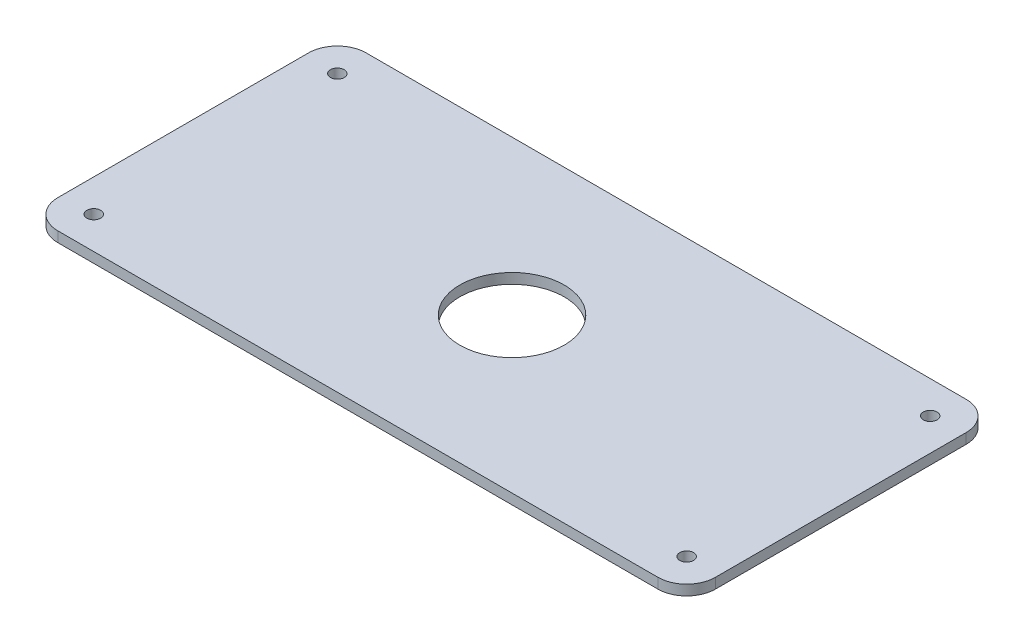
ISO-10303-21;
HEADER;
FILE_DESCRIPTION(('STEP AP214'),'2;1');
FILE_NAME('part.step','',(''),(''),'','','');
FILE_SCHEMA(('AUTOMOTIVE_DESIGN { 1 0 10303 214 1 1 1 1 }'));
ENDSEC;
DATA;
#1=APPLICATION_CONTEXT('core data for automotive mechanical design processes');
#2=APPLICATION_PROTOCOL_DEFINITION('international standard','automotive_design',2000,#1);
#3=PRODUCT_CONTEXT('',#1,'mechanical');
#4=PRODUCT('Part','Part','',(#3));
#5=PRODUCT_RELATED_PRODUCT_CATEGORY('part','',(#4));
#6=PRODUCT_DEFINITION_FORMATION('','',#4);
#7=PRODUCT_DEFINITION_CONTEXT('part definition',#1,'design');
#8=PRODUCT_DEFINITION('design','',#6,#7);
#9=PRODUCT_DEFINITION_SHAPE('','',#8);
#10=(LENGTH_UNIT() NAMED_UNIT(*) SI_UNIT(.MILLI.,.METRE.));
#11=(NAMED_UNIT(*) PLANE_ANGLE_UNIT() SI_UNIT($,.RADIAN.));
#12=(NAMED_UNIT(*) SI_UNIT($,.STERADIAN.) SOLID_ANGLE_UNIT());
#13=UNCERTAINTY_MEASURE_WITH_UNIT(LENGTH_MEASURE(1.E-05),#10,'distance_accuracy_value','');
#14=(GEOMETRIC_REPRESENTATION_CONTEXT(3) GLOBAL_UNCERTAINTY_ASSIGNED_CONTEXT((#13)) GLOBAL_UNIT_ASSIGNED_CONTEXT((#10,
#11,#12)) REPRESENTATION_CONTEXT('',''));
#15=CARTESIAN_POINT('',(0.,0.,0.));
#16=DIRECTION('',(0.,0.,1.));
#17=DIRECTION('',(1.,0.,0.));
#18=AXIS2_PLACEMENT_3D('',#15,#16,#17);
#19=CARTESIAN_POINT('',(203.2,6.35,95.25));
#20=DIRECTION('',(-1.,0.,0.));
#21=DIRECTION('',(0.,0.,1.));
#22=AXIS2_PLACEMENT_3D('',#19,#20,#21);
#23=PLANE('',#22);
#24=DIRECTION('',(0.,0.,-1.));
#25=VECTOR('',#24,1.);
#26=CARTESIAN_POINT('',(203.2,0.,95.25));
#27=LINE('',#26,#25);
#28=CARTESIAN_POINT('',(203.2,0.,77.47));
#29=VERTEX_POINT('',#28);
#30=CARTESIAN_POINT('',(203.2,0.,-77.47));
#31=VERTEX_POINT('',#30);
#32=EDGE_CURVE('E163',#29,#31,#27,.T.);
#33=ORIENTED_EDGE('',*,*,#32,.T.);
#34=DIRECTION('',(0.,-1.,0.));
#35=VECTOR('',#34,1.);
#36=CARTESIAN_POINT('',(203.2,6.35,-77.47));
#37=LINE('',#36,#35);
#38=CARTESIAN_POINT('',(203.2,6.35,-77.47));
#39=VERTEX_POINT('',#38);
#40=EDGE_CURVE('E11',#31,#39,#37,.F.);
#41=ORIENTED_EDGE('',*,*,#40,.T.);
#42=DIRECTION('',(0.,0.,-1.));
#43=VECTOR('',#42,1.);
#44=CARTESIAN_POINT('',(203.2,6.35,95.25));
#45=LINE('',#44,#43);
#46=CARTESIAN_POINT('',(203.2,6.35,77.47));
#47=VERTEX_POINT('',#46);
#48=EDGE_CURVE('E131',#47,#39,#45,.T.);
#49=ORIENTED_EDGE('',*,*,#48,.F.);
#50=DIRECTION('',(0.,-1.,0.));
#51=VECTOR('',#50,1.);
#52=CARTESIAN_POINT('',(203.2,6.35,77.47));
#53=LINE('',#52,#51);
#54=EDGE_CURVE('E47',#47,#29,#53,.T.);
#55=ORIENTED_EDGE('',*,*,#54,.T.);
#56=EDGE_LOOP('',(#33,#41,#49,#55));
#57=FACE_BOUND('',#56,.T.);
#58=ADVANCED_FACE('F39',(#57),#23,.F.);
#59=CARTESIAN_POINT('',(-203.2,6.35,-95.25));
#60=DIRECTION('',(0.,0.,1.));
#61=DIRECTION('',(1.,0.,0.));
#62=AXIS2_PLACEMENT_3D('',#59,#60,#61);
#63=PLANE('',#62);
#64=DIRECTION('',(-1.,0.,0.));
#65=VECTOR('',#64,1.);
#66=CARTESIAN_POINT('',(-203.2,0.,-95.25));
#67=LINE('',#66,#65);
#68=CARTESIAN_POINT('',(185.42,0.,-95.25));
#69=VERTEX_POINT('',#68);
#70=CARTESIAN_POINT('',(-185.42,0.,-95.25));
#71=VERTEX_POINT('',#70);
#72=EDGE_CURVE('E136',#69,#71,#67,.T.);
#73=ORIENTED_EDGE('',*,*,#72,.T.);
#74=DIRECTION('',(0.,-1.,0.));
#75=VECTOR('',#74,1.);
#76=CARTESIAN_POINT('',(-185.42,6.35,-95.25));
#77=LINE('',#76,#75);
#78=CARTESIAN_POINT('',(-185.42,6.35,-95.25));
#79=VERTEX_POINT('',#78);
#80=EDGE_CURVE('E54',#71,#79,#77,.F.);
#81=ORIENTED_EDGE('',*,*,#80,.T.);
#82=DIRECTION('',(-1.,0.,0.));
#83=VECTOR('',#82,1.);
#84=CARTESIAN_POINT('',(-203.2,6.35,-95.25));
#85=LINE('',#84,#83);
#86=CARTESIAN_POINT('',(185.42,6.35,-95.25));
#87=VERTEX_POINT('',#86);
#88=EDGE_CURVE('E134',#87,#79,#85,.T.);
#89=ORIENTED_EDGE('',*,*,#88,.F.);
#90=DIRECTION('',(0.,-1.,0.));
#91=VECTOR('',#90,1.);
#92=CARTESIAN_POINT('',(185.42,6.35,-95.25));
#93=LINE('',#92,#91);
#94=EDGE_CURVE('E155',#87,#69,#93,.T.);
#95=ORIENTED_EDGE('',*,*,#94,.T.);
#96=EDGE_LOOP('',(#73,#81,#89,#95));
#97=FACE_BOUND('',#96,.T.);
#98=ADVANCED_FACE('F223',(#97),#63,.F.);
#99=CARTESIAN_POINT('',(-203.2,6.35,95.25));
#100=DIRECTION('',(1.,0.,0.));
#101=DIRECTION('',(0.,0.,-1.));
#102=AXIS2_PLACEMENT_3D('',#99,#100,#101);
#103=PLANE('',#102);
#104=DIRECTION('',(0.,0.,1.));
#105=VECTOR('',#104,1.);
#106=CARTESIAN_POINT('',(-203.2,0.,95.25));
#107=LINE('',#106,#105);
#108=CARTESIAN_POINT('',(-203.2,0.,-77.47));
#109=VERTEX_POINT('',#108);
#110=CARTESIAN_POINT('',(-203.2,0.,77.47));
#111=VERTEX_POINT('',#110);
#112=EDGE_CURVE('E132',#109,#111,#107,.T.);
#113=ORIENTED_EDGE('',*,*,#112,.T.);
#114=DIRECTION('',(0.,-1.,0.));
#115=VECTOR('',#114,1.);
#116=CARTESIAN_POINT('',(-203.2,6.35,77.47));
#117=LINE('',#116,#115);
#118=CARTESIAN_POINT('',(-203.2,6.35,77.47));
#119=VERTEX_POINT('',#118);
#120=EDGE_CURVE('E110',#111,#119,#117,.F.);
#121=ORIENTED_EDGE('',*,*,#120,.T.);
#122=DIRECTION('',(0.,0.,1.));
#123=VECTOR('',#122,1.);
#124=CARTESIAN_POINT('',(-203.2,6.35,95.25));
#125=LINE('',#124,#123);
#126=CARTESIAN_POINT('',(-203.2,6.35,-77.47));
#127=VERTEX_POINT('',#126);
#128=EDGE_CURVE('E175',#127,#119,#125,.T.);
#129=ORIENTED_EDGE('',*,*,#128,.F.);
#130=DIRECTION('',(0.,-1.,0.));
#131=VECTOR('',#130,1.);
#132=CARTESIAN_POINT('',(-203.2,6.35,-77.47));
#133=LINE('',#132,#131);
#134=EDGE_CURVE('E115',#127,#109,#133,.T.);
#135=ORIENTED_EDGE('',*,*,#134,.T.);
#136=EDGE_LOOP('',(#113,#121,#129,#135));
#137=FACE_BOUND('',#136,.T.);
#138=ADVANCED_FACE('F220',(#137),#103,.F.);
#139=CARTESIAN_POINT('',(-203.2,6.35,95.25));
#140=DIRECTION('',(0.,0.,-1.));
#141=DIRECTION('',(-1.,0.,0.));
#142=AXIS2_PLACEMENT_3D('',#139,#140,#141);
#143=PLANE('',#142);
#144=DIRECTION('',(1.,0.,0.));
#145=VECTOR('',#144,1.);
#146=CARTESIAN_POINT('',(-203.2,6.35,95.25));
#147=LINE('',#146,#145);
#148=CARTESIAN_POINT('',(-185.42,6.35,95.25));
#149=VERTEX_POINT('',#148);
#150=CARTESIAN_POINT('',(185.42,6.35,95.25));
#151=VERTEX_POINT('',#150);
#152=EDGE_CURVE('E125',#149,#151,#147,.T.);
#153=ORIENTED_EDGE('',*,*,#152,.F.);
#154=DIRECTION('',(0.,-1.,0.));
#155=VECTOR('',#154,1.);
#156=CARTESIAN_POINT('',(-185.42,6.35,95.25));
#157=LINE('',#156,#155);
#158=CARTESIAN_POINT('',(-185.42,0.,95.25));
#159=VERTEX_POINT('',#158);
#160=EDGE_CURVE('E109',#149,#159,#157,.T.);
#161=ORIENTED_EDGE('',*,*,#160,.T.);
#162=DIRECTION('',(1.,0.,0.));
#163=VECTOR('',#162,1.);
#164=CARTESIAN_POINT('',(-203.2,0.,95.25));
#165=LINE('',#164,#163);
#166=CARTESIAN_POINT('',(185.42,0.,95.25));
#167=VERTEX_POINT('',#166);
#168=EDGE_CURVE('E122',#159,#167,#165,.T.);
#169=ORIENTED_EDGE('',*,*,#168,.T.);
#170=DIRECTION('',(0.,-1.,0.));
#171=VECTOR('',#170,1.);
#172=CARTESIAN_POINT('',(185.42,6.35,95.25));
#173=LINE('',#172,#171);
#174=EDGE_CURVE('E127',#167,#151,#173,.F.);
#175=ORIENTED_EDGE('',*,*,#174,.T.);
#176=EDGE_LOOP('',(#153,#161,#169,#175));
#177=FACE_BOUND('',#176,.T.);
#178=ADVANCED_FACE('F121',(#177),#143,.F.);
#179=CARTESIAN_POINT('',(0.,6.35,0.));
#180=DIRECTION('',(0.,-1.,0.));
#181=DIRECTION('',(0.,0.,-1.));
#182=AXIS2_PLACEMENT_3D('',#179,#180,#181);
#183=PLANE('',#182);
#184=CARTESIAN_POINT('',(-183.2,6.35,-75.25));
#185=DIRECTION('',(0.,1.,0.));
#186=DIRECTION('',(0.,0.,1.));
#187=AXIS2_PLACEMENT_3D('',#184,#185,#186);
#188=CIRCLE('',#187,4.25000000000001);
#189=CARTESIAN_POINT('',(-183.2,6.35,-71.));
#190=VERTEX_POINT('',#189);
#191=EDGE_CURVE('E185',#190,#190,#188,.T.);
#192=ORIENTED_EDGE('',*,*,#191,.F.);
#193=EDGE_LOOP('',(#192));
#194=FACE_BOUND('',#193,.T.);
#195=CARTESIAN_POINT('',(183.2,6.35,75.25));
#196=DIRECTION('',(0.,1.,0.));
#197=DIRECTION('',(0.,0.,1.));
#198=AXIS2_PLACEMENT_3D('',#195,#196,#197);
#199=CIRCLE('',#198,4.25000000000001);
#200=CARTESIAN_POINT('',(183.2,6.35,79.5));
#201=VERTEX_POINT('',#200);
#202=EDGE_CURVE('E191',#201,#201,#199,.T.);
#203=ORIENTED_EDGE('',*,*,#202,.F.);
#204=EDGE_LOOP('',(#203));
#205=FACE_BOUND('',#204,.T.);
#206=CARTESIAN_POINT('',(-183.2,6.35,75.25));
#207=DIRECTION('',(0.,1.,0.));
#208=DIRECTION('',(0.,0.,1.));
#209=AXIS2_PLACEMENT_3D('',#206,#207,#208);
#210=CIRCLE('',#209,4.25000000000001);
#211=CARTESIAN_POINT('',(-183.2,6.35,79.5));
#212=VERTEX_POINT('',#211);
#213=EDGE_CURVE('E192',#212,#212,#210,.T.);
#214=ORIENTED_EDGE('',*,*,#213,.F.);
#215=EDGE_LOOP('',(#214));
#216=FACE_BOUND('',#215,.T.);
#217=CARTESIAN_POINT('',(183.2,6.35,-75.25));
#218=DIRECTION('',(0.,1.,0.));
#219=DIRECTION('',(0.,0.,1.));
#220=AXIS2_PLACEMENT_3D('',#217,#218,#219);
#221=CIRCLE('',#220,4.25000000000001);
#222=CARTESIAN_POINT('',(183.2,6.35,-71.));
#223=VERTEX_POINT('',#222);
#224=EDGE_CURVE('E182',#223,#223,#221,.T.);
#225=ORIENTED_EDGE('',*,*,#224,.F.);
#226=EDGE_LOOP('',(#225));
#227=FACE_BOUND('',#226,.T.);
#228=CARTESIAN_POINT('',(0.,6.35,0.));
#229=DIRECTION('',(0.,1.,0.));
#230=DIRECTION('',(0.,0.,1.));
#231=AXIS2_PLACEMENT_3D('',#228,#229,#230);
#232=CIRCLE('',#231,32.25);
#233=CARTESIAN_POINT('',(0.,6.35,32.25));
#234=VERTEX_POINT('',#233);
#235=EDGE_CURVE('E171',#234,#234,#232,.T.);
#236=ORIENTED_EDGE('',*,*,#235,.F.);
#237=EDGE_LOOP('',(#236));
#238=FACE_BOUND('',#237,.T.);
#239=ORIENTED_EDGE('',*,*,#128,.T.);
#240=CARTESIAN_POINT('',(-185.42,6.35,77.47));
#241=DIRECTION('',(0.,-1.,0.));
#242=DIRECTION('',(0.,0.,-1.));
#243=AXIS2_PLACEMENT_3D('',#240,#241,#242);
#244=CIRCLE('',#243,17.78);
#245=EDGE_CURVE('E153',#119,#149,#244,.F.);
#246=ORIENTED_EDGE('',*,*,#245,.T.);
#247=ORIENTED_EDGE('',*,*,#152,.T.);
#248=CARTESIAN_POINT('',(185.42,6.35,77.47));
#249=DIRECTION('',(0.,-1.,0.));
#250=DIRECTION('',(0.,0.,-1.));
#251=AXIS2_PLACEMENT_3D('',#248,#249,#250);
#252=CIRCLE('',#251,17.78);
#253=EDGE_CURVE('E148',#151,#47,#252,.F.);
#254=ORIENTED_EDGE('',*,*,#253,.T.);
#255=ORIENTED_EDGE('',*,*,#48,.T.);
#256=CARTESIAN_POINT('',(185.42,6.35,-77.47));
#257=DIRECTION('',(0.,-1.,0.));
#258=DIRECTION('',(0.,0.,-1.));
#259=AXIS2_PLACEMENT_3D('',#256,#257,#258);
#260=CIRCLE('',#259,17.78);
#261=EDGE_CURVE('E61',#39,#87,#260,.F.);
#262=ORIENTED_EDGE('',*,*,#261,.T.);
#263=ORIENTED_EDGE('',*,*,#88,.T.);
#264=CARTESIAN_POINT('',(-185.42,6.35,-77.47));
#265=DIRECTION('',(0.,-1.,0.));
#266=DIRECTION('',(0.,0.,-1.));
#267=AXIS2_PLACEMENT_3D('',#264,#265,#266);
#268=CIRCLE('',#267,17.78);
#269=EDGE_CURVE('E151',#79,#127,#268,.F.);
#270=ORIENTED_EDGE('',*,*,#269,.T.);
#271=EDGE_LOOP('',(#239,#246,#247,#254,#255,#262,#263,#270));
#272=FACE_BOUND('',#271,.T.);
#273=ADVANCED_FACE('F208',(#194,#205,#216,#227,#238,#272),#183,.F.);
#274=CARTESIAN_POINT('',(0.,0.,0.));
#275=DIRECTION('',(0.,-1.,0.));
#276=DIRECTION('',(0.,0.,-1.));
#277=AXIS2_PLACEMENT_3D('',#274,#275,#276);
#278=PLANE('',#277);
#279=CARTESIAN_POINT('',(-183.2,0.,-75.25));
#280=DIRECTION('',(0.,1.,0.));
#281=DIRECTION('',(0.,0.,1.));
#282=AXIS2_PLACEMENT_3D('',#279,#280,#281);
#283=CIRCLE('',#282,4.25000000000001);
#284=CARTESIAN_POINT('',(-183.2,0.,-71.));
#285=VERTEX_POINT('',#284);
#286=EDGE_CURVE('E195',#285,#285,#283,.T.);
#287=ORIENTED_EDGE('',*,*,#286,.T.);
#288=EDGE_LOOP('',(#287));
#289=FACE_BOUND('',#288,.T.);
#290=CARTESIAN_POINT('',(183.2,0.,75.25));
#291=DIRECTION('',(0.,1.,0.));
#292=DIRECTION('',(0.,0.,1.));
#293=AXIS2_PLACEMENT_3D('',#290,#291,#292);
#294=CIRCLE('',#293,4.25000000000001);
#295=CARTESIAN_POINT('',(183.2,0.,79.5));
#296=VERTEX_POINT('',#295);
#297=EDGE_CURVE('E188',#296,#296,#294,.T.);
#298=ORIENTED_EDGE('',*,*,#297,.T.);
#299=EDGE_LOOP('',(#298));
#300=FACE_BOUND('',#299,.T.);
#301=CARTESIAN_POINT('',(-183.2,0.,75.25));
#302=DIRECTION('',(0.,1.,0.));
#303=DIRECTION('',(0.,0.,1.));
#304=AXIS2_PLACEMENT_3D('',#301,#302,#303);
#305=CIRCLE('',#304,4.25000000000001);
#306=CARTESIAN_POINT('',(-183.2,0.,79.5));
#307=VERTEX_POINT('',#306);
#308=EDGE_CURVE('E200',#307,#307,#305,.T.);
#309=ORIENTED_EDGE('',*,*,#308,.T.);
#310=EDGE_LOOP('',(#309));
#311=FACE_BOUND('',#310,.T.);
#312=CARTESIAN_POINT('',(183.2,0.,-75.25));
#313=DIRECTION('',(0.,1.,0.));
#314=DIRECTION('',(0.,0.,1.));
#315=AXIS2_PLACEMENT_3D('',#312,#313,#314);
#316=CIRCLE('',#315,4.25000000000001);
#317=CARTESIAN_POINT('',(183.2,0.,-71.));
#318=VERTEX_POINT('',#317);
#319=EDGE_CURVE('E180',#318,#318,#316,.T.);
#320=ORIENTED_EDGE('',*,*,#319,.T.);
#321=EDGE_LOOP('',(#320));
#322=FACE_BOUND('',#321,.T.);
#323=CARTESIAN_POINT('',(0.,0.,0.));
#324=DIRECTION('',(0.,1.,0.));
#325=DIRECTION('',(0.,0.,1.));
#326=AXIS2_PLACEMENT_3D('',#323,#324,#325);
#327=CIRCLE('',#326,32.25);
#328=CARTESIAN_POINT('',(0.,0.,32.25));
#329=VERTEX_POINT('',#328);
#330=EDGE_CURVE('E168',#329,#329,#327,.T.);
#331=ORIENTED_EDGE('',*,*,#330,.T.);
#332=EDGE_LOOP('',(#331));
#333=FACE_BOUND('',#332,.T.);
#334=ORIENTED_EDGE('',*,*,#168,.F.);
#335=CARTESIAN_POINT('',(-185.42,0.,77.47));
#336=DIRECTION('',(0.,-1.,0.));
#337=DIRECTION('',(0.,0.,-1.));
#338=AXIS2_PLACEMENT_3D('',#335,#336,#337);
#339=CIRCLE('',#338,17.78);
#340=EDGE_CURVE('E105',#159,#111,#339,.T.);
#341=ORIENTED_EDGE('',*,*,#340,.T.);
#342=ORIENTED_EDGE('',*,*,#112,.F.);
#343=CARTESIAN_POINT('',(-185.42,0.,-77.47));
#344=DIRECTION('',(0.,-1.,0.));
#345=DIRECTION('',(0.,0.,-1.));
#346=AXIS2_PLACEMENT_3D('',#343,#344,#345);
#347=CIRCLE('',#346,17.78);
#348=EDGE_CURVE('E116',#109,#71,#347,.T.);
#349=ORIENTED_EDGE('',*,*,#348,.T.);
#350=ORIENTED_EDGE('',*,*,#72,.F.);
#351=CARTESIAN_POINT('',(185.42,0.,-77.47));
#352=DIRECTION('',(0.,-1.,0.));
#353=DIRECTION('',(0.,0.,-1.));
#354=AXIS2_PLACEMENT_3D('',#351,#352,#353);
#355=CIRCLE('',#354,17.78);
#356=EDGE_CURVE('E142',#69,#31,#355,.T.);
#357=ORIENTED_EDGE('',*,*,#356,.T.);
#358=ORIENTED_EDGE('',*,*,#32,.F.);
#359=CARTESIAN_POINT('',(185.42,0.,77.47));
#360=DIRECTION('',(0.,-1.,0.));
#361=DIRECTION('',(0.,0.,-1.));
#362=AXIS2_PLACEMENT_3D('',#359,#360,#361);
#363=CIRCLE('',#362,17.78);
#364=EDGE_CURVE('E126',#29,#167,#363,.T.);
#365=ORIENTED_EDGE('',*,*,#364,.T.);
#366=EDGE_LOOP('',(#334,#341,#342,#349,#350,#357,#358,#365));
#367=FACE_BOUND('',#366,.T.);
#368=ADVANCED_FACE('F129',(#289,#300,#311,#322,#333,#367),#278,.T.);
#369=CARTESIAN_POINT('',(0.,0.,0.));
#370=DIRECTION('',(0.,1.,0.));
#371=DIRECTION('',(0.,0.,1.));
#372=AXIS2_PLACEMENT_3D('',#369,#370,#371);
#373=CYLINDRICAL_SURFACE('',#372,32.25);
#374=ORIENTED_EDGE('',*,*,#330,.F.);
#375=EDGE_LOOP('',(#374));
#376=FACE_BOUND('',#375,.T.);
#377=ORIENTED_EDGE('',*,*,#235,.T.);
#378=EDGE_LOOP('',(#377));
#379=FACE_BOUND('',#378,.T.);
#380=ADVANCED_FACE('F297',(#376,#379),#373,.F.);
#381=CARTESIAN_POINT('',(183.2,0.,-75.25));
#382=DIRECTION('',(0.,1.,0.));
#383=DIRECTION('',(0.,0.,1.));
#384=AXIS2_PLACEMENT_3D('',#381,#382,#383);
#385=CYLINDRICAL_SURFACE('',#384,4.25000000000001);
#386=ORIENTED_EDGE('',*,*,#319,.F.);
#387=EDGE_LOOP('',(#386));
#388=FACE_BOUND('',#387,.T.);
#389=ORIENTED_EDGE('',*,*,#224,.T.);
#390=EDGE_LOOP('',(#389));
#391=FACE_BOUND('',#390,.T.);
#392=ADVANCED_FACE('F288',(#388,#391),#385,.F.);
#393=CARTESIAN_POINT('',(-183.2,0.,75.25));
#394=DIRECTION('',(0.,1.,0.));
#395=DIRECTION('',(0.,0.,1.));
#396=AXIS2_PLACEMENT_3D('',#393,#394,#395);
#397=CYLINDRICAL_SURFACE('',#396,4.25000000000001);
#398=ORIENTED_EDGE('',*,*,#308,.F.);
#399=EDGE_LOOP('',(#398));
#400=FACE_BOUND('',#399,.T.);
#401=ORIENTED_EDGE('',*,*,#213,.T.);
#402=EDGE_LOOP('',(#401));
#403=FACE_BOUND('',#402,.T.);
#404=ADVANCED_FACE('F206',(#400,#403),#397,.F.);
#405=CARTESIAN_POINT('',(183.2,0.,75.25));
#406=DIRECTION('',(0.,1.,0.));
#407=DIRECTION('',(0.,0.,1.));
#408=AXIS2_PLACEMENT_3D('',#405,#406,#407);
#409=CYLINDRICAL_SURFACE('',#408,4.25000000000001);
#410=ORIENTED_EDGE('',*,*,#297,.F.);
#411=EDGE_LOOP('',(#410));
#412=FACE_BOUND('',#411,.T.);
#413=ORIENTED_EDGE('',*,*,#202,.T.);
#414=EDGE_LOOP('',(#413));
#415=FACE_BOUND('',#414,.T.);
#416=ADVANCED_FACE('F271',(#412,#415),#409,.F.);
#417=CARTESIAN_POINT('',(-183.2,0.,-75.25));
#418=DIRECTION('',(0.,1.,0.));
#419=DIRECTION('',(0.,0.,1.));
#420=AXIS2_PLACEMENT_3D('',#417,#418,#419);
#421=CYLINDRICAL_SURFACE('',#420,4.25000000000001);
#422=ORIENTED_EDGE('',*,*,#286,.F.);
#423=EDGE_LOOP('',(#422));
#424=FACE_BOUND('',#423,.T.);
#425=ORIENTED_EDGE('',*,*,#191,.T.);
#426=EDGE_LOOP('',(#425));
#427=FACE_BOUND('',#426,.T.);
#428=ADVANCED_FACE('F242',(#424,#427),#421,.F.);
#429=CARTESIAN_POINT('',(-185.42,6.35,77.47));
#430=DIRECTION('',(0.,-1.,0.));
#431=DIRECTION('',(0.,0.,-1.));
#432=AXIS2_PLACEMENT_3D('',#429,#430,#431);
#433=CYLINDRICAL_SURFACE('',#432,17.78);
#434=ORIENTED_EDGE('',*,*,#245,.F.);
#435=ORIENTED_EDGE('',*,*,#120,.F.);
#436=ORIENTED_EDGE('',*,*,#340,.F.);
#437=ORIENTED_EDGE('',*,*,#160,.F.);
#438=EDGE_LOOP('',(#434,#435,#436,#437));
#439=FACE_BOUND('',#438,.T.);
#440=ADVANCED_FACE('F108',(#439),#433,.T.);
#441=CARTESIAN_POINT('',(-185.42,6.35,-77.47));
#442=DIRECTION('',(0.,-1.,0.));
#443=DIRECTION('',(0.,0.,-1.));
#444=AXIS2_PLACEMENT_3D('',#441,#442,#443);
#445=CYLINDRICAL_SURFACE('',#444,17.78);
#446=ORIENTED_EDGE('',*,*,#269,.F.);
#447=ORIENTED_EDGE('',*,*,#80,.F.);
#448=ORIENTED_EDGE('',*,*,#348,.F.);
#449=ORIENTED_EDGE('',*,*,#134,.F.);
#450=EDGE_LOOP('',(#446,#447,#448,#449));
#451=FACE_BOUND('',#450,.T.);
#452=ADVANCED_FACE('F222',(#451),#445,.T.);
#453=CARTESIAN_POINT('',(185.42,6.35,-77.47));
#454=DIRECTION('',(0.,-1.,0.));
#455=DIRECTION('',(0.,0.,-1.));
#456=AXIS2_PLACEMENT_3D('',#453,#454,#455);
#457=CYLINDRICAL_SURFACE('',#456,17.78);
#458=ORIENTED_EDGE('',*,*,#261,.F.);
#459=ORIENTED_EDGE('',*,*,#40,.F.);
#460=ORIENTED_EDGE('',*,*,#356,.F.);
#461=ORIENTED_EDGE('',*,*,#94,.F.);
#462=EDGE_LOOP('',(#458,#459,#460,#461));
#463=FACE_BOUND('',#462,.T.);
#464=ADVANCED_FACE('F226',(#463),#457,.T.);
#465=CARTESIAN_POINT('',(185.42,6.35,77.47));
#466=DIRECTION('',(0.,-1.,0.));
#467=DIRECTION('',(0.,0.,-1.));
#468=AXIS2_PLACEMENT_3D('',#465,#466,#467);
#469=CYLINDRICAL_SURFACE('',#468,17.78);
#470=ORIENTED_EDGE('',*,*,#253,.F.);
#471=ORIENTED_EDGE('',*,*,#174,.F.);
#472=ORIENTED_EDGE('',*,*,#364,.F.);
#473=ORIENTED_EDGE('',*,*,#54,.F.);
#474=EDGE_LOOP('',(#470,#471,#472,#473));
#475=FACE_BOUND('',#474,.T.);
#476=ADVANCED_FACE('F41',(#475),#469,.T.);
#477=CLOSED_SHELL('',(#58,#98,#138,#178,#273,#368,#380,#392,#404,#416,#428,#440,#452,#464,#476));
#478=MANIFOLD_SOLID_BREP('B2',#477);
#479=ADVANCED_BREP_SHAPE_REPRESENTATION('',(#18,#478),#14);
#480=SHAPE_DEFINITION_REPRESENTATION(#9,#479);
ENDSEC;
END-ISO-10303-21;
